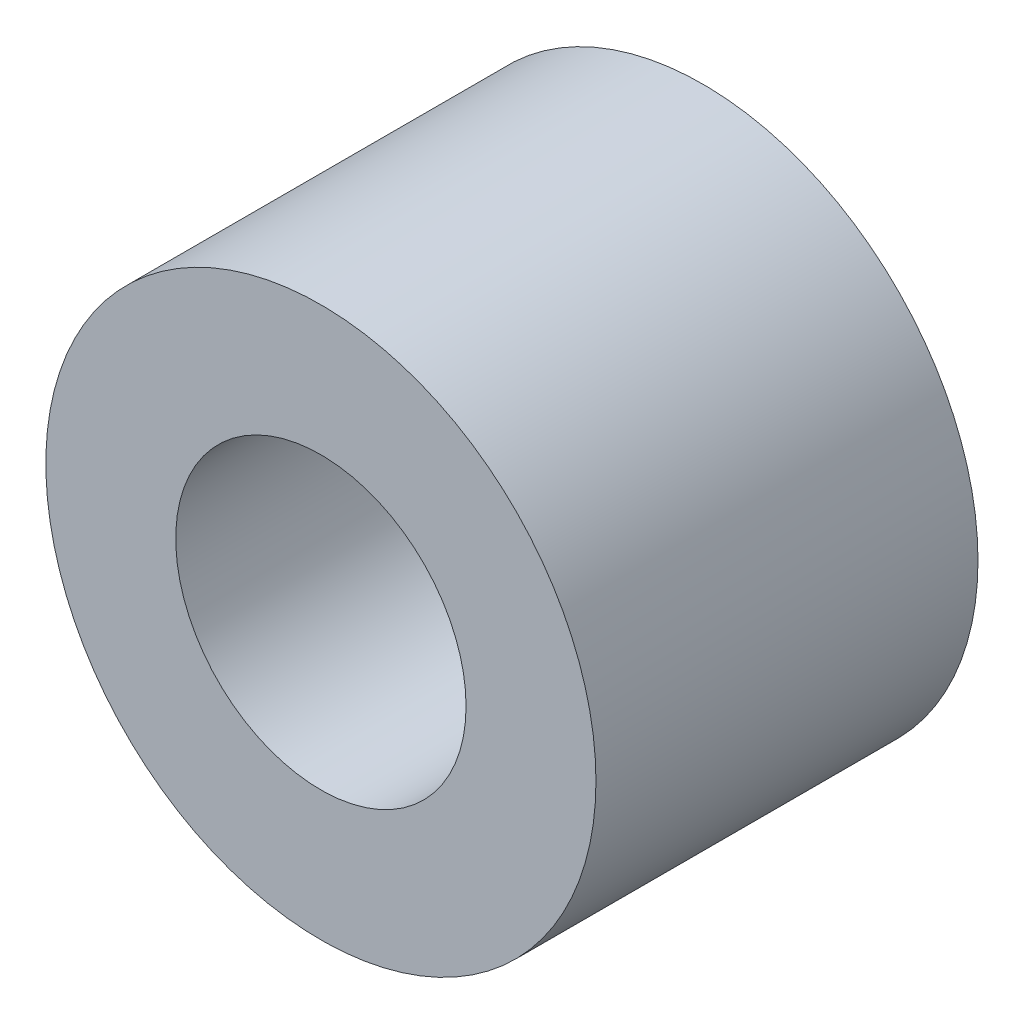
ISO-10303-21;
HEADER;
FILE_DESCRIPTION(('STEP AP214'),'2;1');
FILE_NAME('part.step','',(''),(''),'','','');
FILE_SCHEMA(('AUTOMOTIVE_DESIGN { 1 0 10303 214 1 1 1 1 }'));
ENDSEC;
DATA;
#1=APPLICATION_CONTEXT('core data for automotive mechanical design processes');
#2=APPLICATION_PROTOCOL_DEFINITION('international standard','automotive_design',2000,#1);
#3=PRODUCT_CONTEXT('',#1,'mechanical');
#4=PRODUCT('Part','Part','',(#3));
#5=PRODUCT_RELATED_PRODUCT_CATEGORY('part','',(#4));
#6=PRODUCT_DEFINITION_FORMATION('','',#4);
#7=PRODUCT_DEFINITION_CONTEXT('part definition',#1,'design');
#8=PRODUCT_DEFINITION('design','',#6,#7);
#9=PRODUCT_DEFINITION_SHAPE('','',#8);
#10=(LENGTH_UNIT() NAMED_UNIT(*) SI_UNIT(.MILLI.,.METRE.));
#11=(NAMED_UNIT(*) PLANE_ANGLE_UNIT() SI_UNIT($,.RADIAN.));
#12=(NAMED_UNIT(*) SI_UNIT($,.STERADIAN.) SOLID_ANGLE_UNIT());
#13=UNCERTAINTY_MEASURE_WITH_UNIT(LENGTH_MEASURE(1.E-05),#10,'distance_accuracy_value','');
#14=(GEOMETRIC_REPRESENTATION_CONTEXT(3) GLOBAL_UNCERTAINTY_ASSIGNED_CONTEXT((#13)) GLOBAL_UNIT_ASSIGNED_CONTEXT((#10,
#11,#12)) REPRESENTATION_CONTEXT('',''));
#15=CARTESIAN_POINT('',(0.,0.,0.));
#16=DIRECTION('',(0.,0.,1.));
#17=DIRECTION('',(1.,0.,0.));
#18=AXIS2_PLACEMENT_3D('',#15,#16,#17);
#19=CARTESIAN_POINT('',(-4.47629768877991,4.73208612813876,6.35));
#20=DIRECTION('',(0.,0.,1.));
#21=DIRECTION('',(1.,0.,0.));
#22=AXIS2_PLACEMENT_3D('',#19,#20,#21);
#23=PLANE('',#22);
#24=CARTESIAN_POINT('',(-4.47629768877991,4.73208612813876,6.35));
#25=DIRECTION('',(0.,0.,1.));
#26=DIRECTION('',(1.,0.,0.));
#27=AXIS2_PLACEMENT_3D('',#24,#25,#26);
#28=CIRCLE('',#27,4.572);
#29=CARTESIAN_POINT('',(0.0957023112200875,4.73208612813876,6.35));
#30=VERTEX_POINT('',#29);
#31=EDGE_CURVE('E10',#30,#30,#28,.T.);
#32=ORIENTED_EDGE('',*,*,#31,.T.);
#33=EDGE_LOOP('',(#32));
#34=FACE_BOUND('',#33,.T.);
#35=CARTESIAN_POINT('',(-4.47629768877991,4.73208612813876,6.35));
#36=DIRECTION('',(0.,0.,1.));
#37=DIRECTION('',(1.,0.,0.));
#38=AXIS2_PLACEMENT_3D('',#35,#36,#37);
#39=CIRCLE('',#38,2.413);
#40=CARTESIAN_POINT('',(-2.06329768877991,4.73208612813876,6.35));
#41=VERTEX_POINT('',#40);
#42=EDGE_CURVE('E50',#41,#41,#39,.T.);
#43=ORIENTED_EDGE('',*,*,#42,.F.);
#44=EDGE_LOOP('',(#43));
#45=FACE_BOUND('',#44,.T.);
#46=ADVANCED_FACE('F37',(#34,#45),#23,.T.);
#47=CARTESIAN_POINT('',(-4.47629768877991,4.73208612813876,0.));
#48=DIRECTION('',(0.,0.,1.));
#49=DIRECTION('',(1.,0.,0.));
#50=AXIS2_PLACEMENT_3D('',#47,#48,#49);
#51=PLANE('',#50);
#52=CARTESIAN_POINT('',(-4.47629768877991,4.73208612813876,0.));
#53=DIRECTION('',(0.,0.,1.));
#54=DIRECTION('',(1.,0.,0.));
#55=AXIS2_PLACEMENT_3D('',#52,#53,#54);
#56=CIRCLE('',#55,4.572);
#57=CARTESIAN_POINT('',(0.0957023112200875,4.73208612813876,0.));
#58=VERTEX_POINT('',#57);
#59=EDGE_CURVE('E41',#58,#58,#56,.T.);
#60=ORIENTED_EDGE('',*,*,#59,.F.);
#61=EDGE_LOOP('',(#60));
#62=FACE_BOUND('',#61,.T.);
#63=CARTESIAN_POINT('',(-4.47629768877991,4.73208612813876,0.));
#64=DIRECTION('',(0.,0.,1.));
#65=DIRECTION('',(1.,0.,0.));
#66=AXIS2_PLACEMENT_3D('',#63,#64,#65);
#67=CIRCLE('',#66,2.413);
#68=CARTESIAN_POINT('',(-2.06329768877991,4.73208612813876,0.));
#69=VERTEX_POINT('',#68);
#70=EDGE_CURVE('E52',#69,#69,#67,.T.);
#71=ORIENTED_EDGE('',*,*,#70,.T.);
#72=EDGE_LOOP('',(#71));
#73=FACE_BOUND('',#72,.T.);
#74=ADVANCED_FACE('F64',(#62,#73),#51,.F.);
#75=CARTESIAN_POINT('',(-4.47629768877991,4.73208612813876,6.35));
#76=DIRECTION('',(0.,0.,-1.));
#77=DIRECTION('',(-1.,0.,0.));
#78=AXIS2_PLACEMENT_3D('',#75,#76,#77);
#79=CYLINDRICAL_SURFACE('',#78,4.572);
#80=ORIENTED_EDGE('',*,*,#31,.F.);
#81=EDGE_LOOP('',(#80));
#82=FACE_BOUND('',#81,.T.);
#83=ORIENTED_EDGE('',*,*,#59,.T.);
#84=EDGE_LOOP('',(#83));
#85=FACE_BOUND('',#84,.T.);
#86=ADVANCED_FACE('F39',(#82,#85),#79,.T.);
#87=CARTESIAN_POINT('',(-4.47629768877991,4.73208612813876,6.35));
#88=DIRECTION('',(0.,0.,-1.));
#89=DIRECTION('',(-1.,0.,0.));
#90=AXIS2_PLACEMENT_3D('',#87,#88,#89);
#91=CYLINDRICAL_SURFACE('',#90,2.413);
#92=ORIENTED_EDGE('',*,*,#42,.T.);
#93=EDGE_LOOP('',(#92));
#94=FACE_BOUND('',#93,.T.);
#95=ORIENTED_EDGE('',*,*,#70,.F.);
#96=EDGE_LOOP('',(#95));
#97=FACE_BOUND('',#96,.T.);
#98=ADVANCED_FACE('F60',(#94,#97),#91,.F.);
#99=CLOSED_SHELL('',(#46,#74,#86,#98));
#100=MANIFOLD_SOLID_BREP('B2',#99);
#101=ADVANCED_BREP_SHAPE_REPRESENTATION('',(#18,#100),#14);
#102=SHAPE_DEFINITION_REPRESENTATION(#9,#101);
ENDSEC;
END-ISO-10303-21;
